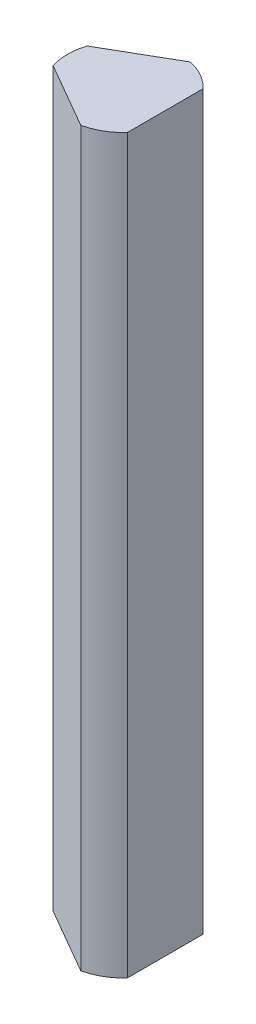
ISO-10303-21;
HEADER;
FILE_DESCRIPTION(('STEP AP214'),'2;1');
FILE_NAME('part.step','',(''),(''),'','','');
FILE_SCHEMA(('AUTOMOTIVE_DESIGN { 1 0 10303 214 1 1 1 1 }'));
ENDSEC;
DATA;
#1=APPLICATION_CONTEXT('core data for automotive mechanical design processes');
#2=APPLICATION_PROTOCOL_DEFINITION('international standard','automotive_design',2000,#1);
#3=PRODUCT_CONTEXT('',#1,'mechanical');
#4=PRODUCT('Part','Part','',(#3));
#5=PRODUCT_RELATED_PRODUCT_CATEGORY('part','',(#4));
#6=PRODUCT_DEFINITION_FORMATION('','',#4);
#7=PRODUCT_DEFINITION_CONTEXT('part definition',#1,'design');
#8=PRODUCT_DEFINITION('design','',#6,#7);
#9=PRODUCT_DEFINITION_SHAPE('','',#8);
#10=(LENGTH_UNIT() NAMED_UNIT(*) SI_UNIT(.MILLI.,.METRE.));
#11=(NAMED_UNIT(*) PLANE_ANGLE_UNIT() SI_UNIT($,.RADIAN.));
#12=(NAMED_UNIT(*) SI_UNIT($,.STERADIAN.) SOLID_ANGLE_UNIT());
#13=UNCERTAINTY_MEASURE_WITH_UNIT(LENGTH_MEASURE(1.E-05),#10,'distance_accuracy_value','');
#14=(GEOMETRIC_REPRESENTATION_CONTEXT(3) GLOBAL_UNCERTAINTY_ASSIGNED_CONTEXT((#13)) GLOBAL_UNIT_ASSIGNED_CONTEXT((#10,
#11,#12)) REPRESENTATION_CONTEXT('',''));
#15=CARTESIAN_POINT('',(0.,0.,0.));
#16=DIRECTION('',(0.,0.,1.));
#17=DIRECTION('',(1.,0.,0.));
#18=AXIS2_PLACEMENT_3D('',#15,#16,#17);
#19=CARTESIAN_POINT('',(0.,30.,0.));
#20=DIRECTION('',(0.,-1.,0.));
#21=DIRECTION('',(0.,0.,-1.));
#22=AXIS2_PLACEMENT_3D('',#19,#20,#21);
#23=CYLINDRICAL_SURFACE('',#22,2.3);
#24=CARTESIAN_POINT('',(0.,0.,0.));
#25=DIRECTION('',(0.,1.,0.));
#26=DIRECTION('',(0.,0.,1.));
#27=AXIS2_PLACEMENT_3D('',#24,#25,#26);
#28=CIRCLE('',#27,2.3);
#29=CARTESIAN_POINT('',(0.491640786499875,0.,2.24683985567503));
#30=VERTEX_POINT('',#29);
#31=CARTESIAN_POINT('',(1.7,0.,1.54919333848297));
#32=VERTEX_POINT('',#31);
#33=EDGE_CURVE('E119',#30,#32,#28,.T.);
#34=ORIENTED_EDGE('',*,*,#33,.T.);
#35=DIRECTION('',(0.,-1.,0.));
#36=VECTOR('',#35,1.);
#37=CARTESIAN_POINT('',(1.7,30.,1.54919333848297));
#38=LINE('',#37,#36);
#39=CARTESIAN_POINT('',(1.7,30.,1.54919333848297));
#40=VERTEX_POINT('',#39);
#41=EDGE_CURVE('E11',#40,#32,#38,.T.);
#42=ORIENTED_EDGE('',*,*,#41,.F.);
#43=CARTESIAN_POINT('',(0.,30.,0.));
#44=DIRECTION('',(0.,1.,0.));
#45=DIRECTION('',(0.,0.,1.));
#46=AXIS2_PLACEMENT_3D('',#43,#44,#45);
#47=CIRCLE('',#46,2.3);
#48=CARTESIAN_POINT('',(0.491640786499875,30.,2.24683985567503));
#49=VERTEX_POINT('',#48);
#50=EDGE_CURVE('E129',#49,#40,#47,.T.);
#51=ORIENTED_EDGE('',*,*,#50,.F.);
#52=DIRECTION('',(0.,-1.,0.));
#53=VECTOR('',#52,1.);
#54=CARTESIAN_POINT('',(0.491640786499875,30.,2.24683985567503));
#55=LINE('',#54,#53);
#56=EDGE_CURVE('E115',#49,#30,#55,.T.);
#57=ORIENTED_EDGE('',*,*,#56,.T.);
#58=EDGE_LOOP('',(#34,#42,#51,#57));
#59=FACE_BOUND('',#58,.T.);
#60=ADVANCED_FACE('F35',(#59),#23,.T.);
#61=CARTESIAN_POINT('',(1.7,30.,1.54919333848297));
#62=DIRECTION('',(-1.,0.,0.));
#63=DIRECTION('',(0.,0.,1.));
#64=AXIS2_PLACEMENT_3D('',#61,#62,#63);
#65=PLANE('',#64);
#66=DIRECTION('',(0.,0.,-1.));
#67=VECTOR('',#66,1.);
#68=CARTESIAN_POINT('',(1.7,0.,1.54919333848297));
#69=LINE('',#68,#67);
#70=CARTESIAN_POINT('',(1.7,0.,-1.54919333848297));
#71=VERTEX_POINT('',#70);
#72=EDGE_CURVE('E122',#32,#71,#69,.T.);
#73=ORIENTED_EDGE('',*,*,#72,.T.);
#74=DIRECTION('',(0.,-1.,0.));
#75=VECTOR('',#74,1.);
#76=CARTESIAN_POINT('',(1.7,30.,-1.54919333848297));
#77=LINE('',#76,#75);
#78=CARTESIAN_POINT('',(1.7,30.,-1.54919333848297));
#79=VERTEX_POINT('',#78);
#80=EDGE_CURVE('E43',#79,#71,#77,.T.);
#81=ORIENTED_EDGE('',*,*,#80,.F.);
#82=DIRECTION('',(0.,0.,-1.));
#83=VECTOR('',#82,1.);
#84=CARTESIAN_POINT('',(1.7,30.,1.54919333848297));
#85=LINE('',#84,#83);
#86=EDGE_CURVE('E88',#40,#79,#85,.T.);
#87=ORIENTED_EDGE('',*,*,#86,.F.);
#88=ORIENTED_EDGE('',*,*,#41,.T.);
#89=EDGE_LOOP('',(#73,#81,#87,#88));
#90=FACE_BOUND('',#89,.T.);
#91=ADVANCED_FACE('F153',(#90),#65,.F.);
#92=CARTESIAN_POINT('',(0.,30.,0.));
#93=DIRECTION('',(0.,-1.,0.));
#94=DIRECTION('',(0.,0.,-1.));
#95=AXIS2_PLACEMENT_3D('',#92,#93,#94);
#96=CYLINDRICAL_SURFACE('',#95,2.3);
#97=CARTESIAN_POINT('',(0.,0.,0.));
#98=DIRECTION('',(0.,1.,0.));
#99=DIRECTION('',(0.,0.,1.));
#100=AXIS2_PLACEMENT_3D('',#97,#98,#99);
#101=CIRCLE('',#100,2.3);
#102=CARTESIAN_POINT('',(0.491640786499875,0.,-2.24683985567503));
#103=VERTEX_POINT('',#102);
#104=EDGE_CURVE('E124',#71,#103,#101,.T.);
#105=ORIENTED_EDGE('',*,*,#104,.T.);
#106=DIRECTION('',(0.,-1.,0.));
#107=VECTOR('',#106,1.);
#108=CARTESIAN_POINT('',(0.491640786499875,30.,-2.24683985567503));
#109=LINE('',#108,#107);
#110=CARTESIAN_POINT('',(0.491640786499875,30.,-2.24683985567503));
#111=VERTEX_POINT('',#110);
#112=EDGE_CURVE('E110',#111,#103,#109,.T.);
#113=ORIENTED_EDGE('',*,*,#112,.F.);
#114=CARTESIAN_POINT('',(0.,30.,0.));
#115=DIRECTION('',(0.,1.,0.));
#116=DIRECTION('',(0.,0.,1.));
#117=AXIS2_PLACEMENT_3D('',#114,#115,#116);
#118=CIRCLE('',#117,2.3);
#119=EDGE_CURVE('E101',#79,#111,#118,.T.);
#120=ORIENTED_EDGE('',*,*,#119,.F.);
#121=ORIENTED_EDGE('',*,*,#80,.T.);
#122=EDGE_LOOP('',(#105,#113,#120,#121));
#123=FACE_BOUND('',#122,.T.);
#124=ADVANCED_FACE('F135',(#123),#96,.T.);
#125=CARTESIAN_POINT('',(-2.19164078649987,30.,-0.697646517192061));
#126=DIRECTION('',(0.5,0.,0.866025403784439));
#127=DIRECTION('',(0.866025403784439,0.,-0.5));
#128=AXIS2_PLACEMENT_3D('',#125,#126,#127);
#129=PLANE('',#128);
#130=DIRECTION('',(-0.866025403784439,0.,0.5));
#131=VECTOR('',#130,1.);
#132=CARTESIAN_POINT('',(-2.19164078649987,0.,-0.697646517192061));
#133=LINE('',#132,#131);
#134=CARTESIAN_POINT('',(-2.19164078649987,0.,-0.69764651719206));
#135=VERTEX_POINT('',#134);
#136=EDGE_CURVE('E109',#103,#135,#133,.T.);
#137=ORIENTED_EDGE('',*,*,#136,.T.);
#138=DIRECTION('',(0.,-1.,0.));
#139=VECTOR('',#138,1.);
#140=CARTESIAN_POINT('',(-2.19164078649987,30.,-0.69764651719206));
#141=LINE('',#140,#139);
#142=CARTESIAN_POINT('',(-2.19164078649987,30.,-0.69764651719206));
#143=VERTEX_POINT('',#142);
#144=EDGE_CURVE('E106',#143,#135,#141,.T.);
#145=ORIENTED_EDGE('',*,*,#144,.F.);
#146=DIRECTION('',(-0.866025403784439,0.,0.5));
#147=VECTOR('',#146,1.);
#148=CARTESIAN_POINT('',(-2.19164078649987,30.,-0.697646517192061));
#149=LINE('',#148,#147);
#150=EDGE_CURVE('E95',#111,#143,#149,.T.);
#151=ORIENTED_EDGE('',*,*,#150,.F.);
#152=ORIENTED_EDGE('',*,*,#112,.T.);
#153=EDGE_LOOP('',(#137,#145,#151,#152));
#154=FACE_BOUND('',#153,.T.);
#155=ADVANCED_FACE('F107',(#154),#129,.F.);
#156=CARTESIAN_POINT('',(0.,30.,0.));
#157=DIRECTION('',(0.,-1.,0.));
#158=DIRECTION('',(0.,0.,-1.));
#159=AXIS2_PLACEMENT_3D('',#156,#157,#158);
#160=CYLINDRICAL_SURFACE('',#159,2.3);
#161=CARTESIAN_POINT('',(0.,0.,0.));
#162=DIRECTION('',(0.,1.,0.));
#163=DIRECTION('',(0.,0.,-1.));
#164=AXIS2_PLACEMENT_3D('',#161,#162,#163);
#165=CIRCLE('',#164,2.3);
#166=CARTESIAN_POINT('',(-2.19164078649987,0.,0.697646517192063));
#167=VERTEX_POINT('',#166);
#168=EDGE_CURVE('E74',#135,#167,#165,.T.);
#169=ORIENTED_EDGE('',*,*,#168,.T.);
#170=DIRECTION('',(0.,-1.,0.));
#171=VECTOR('',#170,1.);
#172=CARTESIAN_POINT('',(-2.19164078649987,30.,0.697646517192063));
#173=LINE('',#172,#171);
#174=CARTESIAN_POINT('',(-2.19164078649987,30.,0.697646517192063));
#175=VERTEX_POINT('',#174);
#176=EDGE_CURVE('E111',#175,#167,#173,.T.);
#177=ORIENTED_EDGE('',*,*,#176,.F.);
#178=CARTESIAN_POINT('',(0.,30.,0.));
#179=DIRECTION('',(0.,1.,0.));
#180=DIRECTION('',(0.,0.,-1.));
#181=AXIS2_PLACEMENT_3D('',#178,#179,#180);
#182=CIRCLE('',#181,2.3);
#183=EDGE_CURVE('E99',#143,#175,#182,.T.);
#184=ORIENTED_EDGE('',*,*,#183,.F.);
#185=ORIENTED_EDGE('',*,*,#144,.T.);
#186=EDGE_LOOP('',(#169,#177,#184,#185));
#187=FACE_BOUND('',#186,.T.);
#188=ADVANCED_FACE('F113',(#187),#160,.T.);
#189=CARTESIAN_POINT('',(0.491640786499875,30.,2.24683985567503));
#190=DIRECTION('',(0.5,0.,-0.866025403784439));
#191=DIRECTION('',(-0.866025403784439,0.,-0.5));
#192=AXIS2_PLACEMENT_3D('',#189,#190,#191);
#193=PLANE('',#192);
#194=DIRECTION('',(0.866025403784439,0.,0.5));
#195=VECTOR('',#194,1.);
#196=CARTESIAN_POINT('',(0.491640786499875,0.,2.24683985567503));
#197=LINE('',#196,#195);
#198=EDGE_CURVE('E80',#167,#30,#197,.T.);
#199=ORIENTED_EDGE('',*,*,#198,.T.);
#200=ORIENTED_EDGE('',*,*,#56,.F.);
#201=DIRECTION('',(0.866025403784439,0.,0.5));
#202=VECTOR('',#201,1.);
#203=CARTESIAN_POINT('',(0.491640786499875,30.,2.24683985567503));
#204=LINE('',#203,#202);
#205=EDGE_CURVE('E51',#175,#49,#204,.T.);
#206=ORIENTED_EDGE('',*,*,#205,.F.);
#207=ORIENTED_EDGE('',*,*,#176,.T.);
#208=EDGE_LOOP('',(#199,#200,#206,#207));
#209=FACE_BOUND('',#208,.T.);
#210=ADVANCED_FACE('F142',(#209),#193,.F.);
#211=CARTESIAN_POINT('',(0.,30.,0.));
#212=DIRECTION('',(0.,1.,0.));
#213=DIRECTION('',(0.,0.,1.));
#214=AXIS2_PLACEMENT_3D('',#211,#212,#213);
#215=PLANE('',#214);
#216=ORIENTED_EDGE('',*,*,#50,.T.);
#217=ORIENTED_EDGE('',*,*,#86,.T.);
#218=ORIENTED_EDGE('',*,*,#119,.T.);
#219=ORIENTED_EDGE('',*,*,#150,.T.);
#220=ORIENTED_EDGE('',*,*,#183,.T.);
#221=ORIENTED_EDGE('',*,*,#205,.T.);
#222=EDGE_LOOP('',(#216,#217,#218,#219,#220,#221));
#223=FACE_BOUND('',#222,.T.);
#224=ADVANCED_FACE('F97',(#223),#215,.T.);
#225=CARTESIAN_POINT('',(0.,0.,0.));
#226=DIRECTION('',(0.,1.,0.));
#227=DIRECTION('',(0.,0.,1.));
#228=AXIS2_PLACEMENT_3D('',#225,#226,#227);
#229=PLANE('',#228);
#230=ORIENTED_EDGE('',*,*,#33,.F.);
#231=ORIENTED_EDGE('',*,*,#198,.F.);
#232=ORIENTED_EDGE('',*,*,#168,.F.);
#233=ORIENTED_EDGE('',*,*,#136,.F.);
#234=ORIENTED_EDGE('',*,*,#104,.F.);
#235=ORIENTED_EDGE('',*,*,#72,.F.);
#236=EDGE_LOOP('',(#230,#231,#232,#233,#234,#235));
#237=FACE_BOUND('',#236,.T.);
#238=ADVANCED_FACE('F138',(#237),#229,.F.);
#239=CLOSED_SHELL('',(#60,#91,#124,#155,#188,#210,#224,#238));
#240=MANIFOLD_SOLID_BREP('B2',#239);
#241=ADVANCED_BREP_SHAPE_REPRESENTATION('',(#18,#240),#14);
#242=SHAPE_DEFINITION_REPRESENTATION(#9,#241);
ENDSEC;
END-ISO-10303-21;
